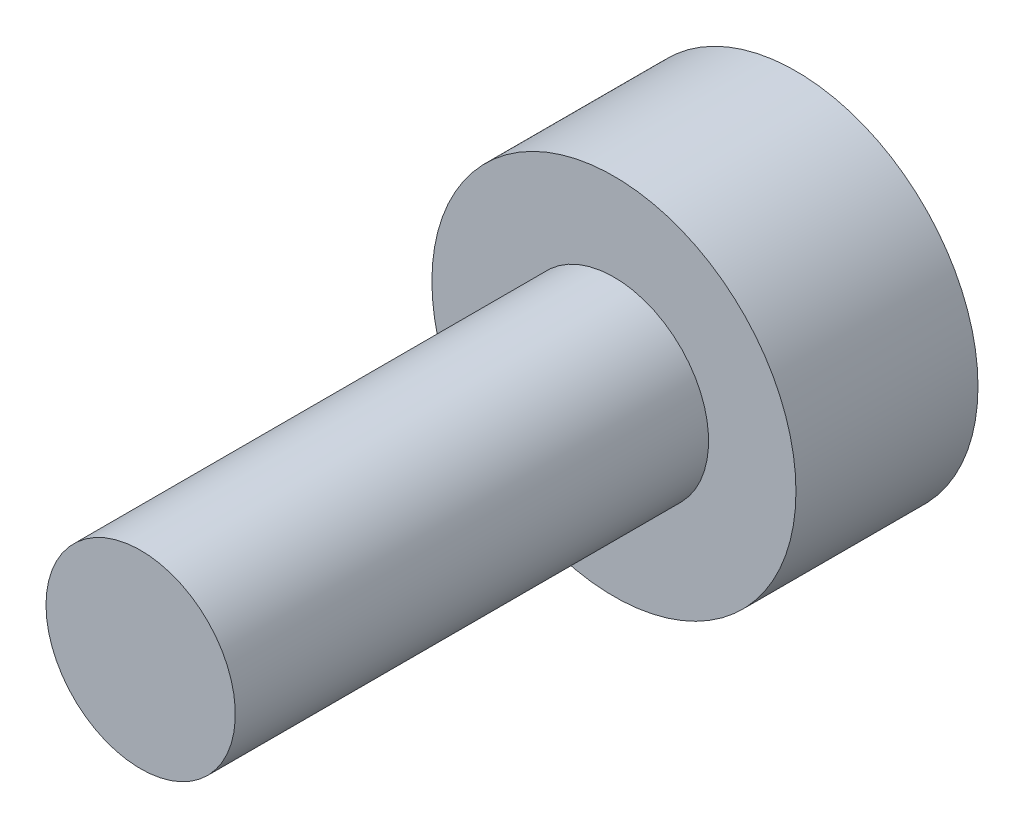
ISO-10303-21;
HEADER;
FILE_DESCRIPTION(('STEP AP214'),'2;1');
FILE_NAME('part.step','',(''),(''),'','','');
FILE_SCHEMA(('AUTOMOTIVE_DESIGN { 1 0 10303 214 1 1 1 1 }'));
ENDSEC;
DATA;
#1=APPLICATION_CONTEXT('core data for automotive mechanical design processes');
#2=APPLICATION_PROTOCOL_DEFINITION('international standard','automotive_design',2000,#1);
#3=PRODUCT_CONTEXT('',#1,'mechanical');
#4=PRODUCT('Part','Part','',(#3));
#5=PRODUCT_RELATED_PRODUCT_CATEGORY('part','',(#4));
#6=PRODUCT_DEFINITION_FORMATION('','',#4);
#7=PRODUCT_DEFINITION_CONTEXT('part definition',#1,'design');
#8=PRODUCT_DEFINITION('design','',#6,#7);
#9=PRODUCT_DEFINITION_SHAPE('','',#8);
#10=(LENGTH_UNIT() NAMED_UNIT(*) SI_UNIT(.MILLI.,.METRE.));
#11=(NAMED_UNIT(*) PLANE_ANGLE_UNIT() SI_UNIT($,.RADIAN.));
#12=(NAMED_UNIT(*) SI_UNIT($,.STERADIAN.) SOLID_ANGLE_UNIT());
#13=UNCERTAINTY_MEASURE_WITH_UNIT(LENGTH_MEASURE(1.E-05),#10,'distance_accuracy_value','');
#14=(GEOMETRIC_REPRESENTATION_CONTEXT(3) GLOBAL_UNCERTAINTY_ASSIGNED_CONTEXT((#13)) GLOBAL_UNIT_ASSIGNED_CONTEXT((#10,
#11,#12)) REPRESENTATION_CONTEXT('',''));
#15=CARTESIAN_POINT('',(0.,0.,0.));
#16=DIRECTION('',(0.,0.,1.));
#17=DIRECTION('',(1.,0.,0.));
#18=AXIS2_PLACEMENT_3D('',#15,#16,#17);
#19=CARTESIAN_POINT('',(0.,0.,13.));
#20=DIRECTION('',(0.,0.,-1.));
#21=DIRECTION('',(-1.,0.,0.));
#22=AXIS2_PLACEMENT_3D('',#19,#20,#21);
#23=CYLINDRICAL_SURFACE('',#22,2.6);
#24=CARTESIAN_POINT('',(0.,0.,13.));
#25=DIRECTION('',(0.,0.,1.));
#26=DIRECTION('',(1.,0.,0.));
#27=AXIS2_PLACEMENT_3D('',#24,#25,#26);
#28=CIRCLE('',#27,2.6);
#29=CARTESIAN_POINT('',(-2.6,0.,13.));
#30=VERTEX_POINT('',#29);
#31=EDGE_CURVE('E10',#30,#30,#28,.T.);
#32=CARTESIAN_POINT('',(0.,0.,0.));
#33=DIRECTION('',(0.,0.,1.));
#34=DIRECTION('',(1.,0.,0.));
#35=AXIS2_PLACEMENT_3D('',#32,#33,#34);
#36=CIRCLE('',#35,2.6);
#37=CARTESIAN_POINT('',(-2.6,0.,0.));
#38=VERTEX_POINT('',#37);
#39=EDGE_CURVE('E40',#38,#38,#36,.T.);
#40=CARTESIAN_POINT('',(-2.6,0.,13.));
#41=CARTESIAN_POINT('',(-2.6,0.,12.8645833333333));
#42=CARTESIAN_POINT('',(-2.6,0.,12.7291666666667));
#43=CARTESIAN_POINT('',(-2.6,0.,12.4583333333333));
#44=CARTESIAN_POINT('',(-2.6,0.,12.3229166666667));
#45=CARTESIAN_POINT('',(-2.6,0.,12.0520833333333));
#46=CARTESIAN_POINT('',(-2.6,0.,11.9166666666667));
#47=CARTESIAN_POINT('',(-2.6,0.,11.6458333333333));
#48=CARTESIAN_POINT('',(-2.6,0.,11.5104166666667));
#49=CARTESIAN_POINT('',(-2.6,0.,11.2395833333333));
#50=CARTESIAN_POINT('',(-2.6,0.,11.1041666666667));
#51=CARTESIAN_POINT('',(-2.6,0.,10.8333333333333));
#52=CARTESIAN_POINT('',(-2.6,0.,10.6979166666667));
#53=CARTESIAN_POINT('',(-2.6,0.,10.4270833333333));
#54=CARTESIAN_POINT('',(-2.6,0.,10.2916666666667));
#55=CARTESIAN_POINT('',(-2.6,0.,10.0208333333333));
#56=CARTESIAN_POINT('',(-2.6,0.,9.88541666666667));
#57=CARTESIAN_POINT('',(-2.6,0.,9.61458333333333));
#58=CARTESIAN_POINT('',(-2.6,0.,9.47916666666667));
#59=CARTESIAN_POINT('',(-2.6,0.,9.20833333333333));
#60=CARTESIAN_POINT('',(-2.6,0.,9.07291666666667));
#61=CARTESIAN_POINT('',(-2.6,0.,8.80208333333333));
#62=CARTESIAN_POINT('',(-2.6,0.,8.66666666666667));
#63=CARTESIAN_POINT('',(-2.6,0.,8.39583333333333));
#64=CARTESIAN_POINT('',(-2.6,0.,8.26041666666667));
#65=CARTESIAN_POINT('',(-2.6,0.,7.98958333333333));
#66=CARTESIAN_POINT('',(-2.6,0.,7.85416666666667));
#67=CARTESIAN_POINT('',(-2.6,0.,7.58333333333333));
#68=CARTESIAN_POINT('',(-2.6,0.,7.44791666666667));
#69=CARTESIAN_POINT('',(-2.6,0.,7.17708333333333));
#70=CARTESIAN_POINT('',(-2.6,0.,7.04166666666667));
#71=CARTESIAN_POINT('',(-2.6,0.,6.77083333333333));
#72=CARTESIAN_POINT('',(-2.6,0.,6.63541666666667));
#73=CARTESIAN_POINT('',(-2.6,0.,6.36458333333333));
#74=CARTESIAN_POINT('',(-2.6,0.,6.22916666666667));
#75=CARTESIAN_POINT('',(-2.6,0.,5.95833333333333));
#76=CARTESIAN_POINT('',(-2.6,0.,5.82291666666667));
#77=CARTESIAN_POINT('',(-2.6,0.,5.55208333333333));
#78=CARTESIAN_POINT('',(-2.6,0.,5.41666666666667));
#79=CARTESIAN_POINT('',(-2.6,0.,5.14583333333333));
#80=CARTESIAN_POINT('',(-2.6,0.,5.01041666666667));
#81=CARTESIAN_POINT('',(-2.6,0.,4.73958333333333));
#82=CARTESIAN_POINT('',(-2.6,0.,4.60416666666667));
#83=CARTESIAN_POINT('',(-2.6,0.,4.33333333333333));
#84=CARTESIAN_POINT('',(-2.6,0.,4.19791666666667));
#85=CARTESIAN_POINT('',(-2.6,0.,3.92708333333333));
#86=CARTESIAN_POINT('',(-2.6,0.,3.79166666666667));
#87=CARTESIAN_POINT('',(-2.6,0.,3.52083333333333));
#88=CARTESIAN_POINT('',(-2.6,0.,3.38541666666667));
#89=CARTESIAN_POINT('',(-2.6,0.,3.11458333333333));
#90=CARTESIAN_POINT('',(-2.6,0.,2.97916666666667));
#91=CARTESIAN_POINT('',(-2.6,0.,2.70833333333333));
#92=CARTESIAN_POINT('',(-2.6,0.,2.57291666666667));
#93=CARTESIAN_POINT('',(-2.6,0.,2.30208333333333));
#94=CARTESIAN_POINT('',(-2.6,0.,2.16666666666667));
#95=CARTESIAN_POINT('',(-2.6,0.,1.89583333333333));
#96=CARTESIAN_POINT('',(-2.6,0.,1.76041666666667));
#97=CARTESIAN_POINT('',(-2.6,0.,1.48958333333333));
#98=CARTESIAN_POINT('',(-2.6,0.,1.35416666666667));
#99=CARTESIAN_POINT('',(-2.6,0.,1.08333333333333));
#100=CARTESIAN_POINT('',(-2.6,0.,0.947916666666667));
#101=CARTESIAN_POINT('',(-2.6,0.,0.677083333333334));
#102=CARTESIAN_POINT('',(-2.6,0.,0.541666666666667));
#103=CARTESIAN_POINT('',(-2.6,0.,0.270833333333334));
#104=CARTESIAN_POINT('',(-2.6,0.,0.135416666666667));
#105=CARTESIAN_POINT('',(-2.6,0.,0.));
#106=B_SPLINE_CURVE_WITH_KNOTS('',3,(#40,#41,#42,#43,#44,#45,#46,#47,#48,#49,#50,#51,#52,#53,
#54,#55,#56,#57,#58,#59,#60,#61,#62,#63,#64,#65,#66,#67,#68,#69,#70,#71,#72,#73,#74,#75,#76,#77,
#78,#79,#80,#81,#82,#83,#84,#85,#86,#87,#88,#89,#90,#91,#92,#93,#94,#95,#96,#97,#98,#99,#100,
#101,#102,#103,#104,#105),.UNSPECIFIED.,.F.,.F.,(4,2,2,2,2,2,2,2,2,2,2,2,2,2,2,2,2,2,2,2,2,2,2,
2,2,2,2,2,2,2,2,2,4),(0.,0.406249999999999,0.812499999999999,1.21875,1.625,2.03125,2.4375,
2.84375,3.25,3.65625,4.0625,4.46875,4.875,5.28125,5.6875,6.09375,6.5,6.90625,7.3125,7.71875,
8.125,8.53125,8.9375,9.34375,9.75,10.15625,10.5625,10.96875,11.375,11.78125,12.1875,12.59375,
13.),.UNSPECIFIED.);
#107=EDGE_CURVE('BSEAM37',#30,#38,#106,.T.);
#108=ORIENTED_EDGE('',*,*,#31,.F.);
#109=ORIENTED_EDGE('',*,*,#39,.T.);
#110=ORIENTED_EDGE('',*,*,#107,.T.);
#111=ORIENTED_EDGE('',*,*,#107,.F.);
#112=EDGE_LOOP('',(#108,#110,#109,#111));
#113=FACE_BOUND('',#112,.T.);
#114=ADVANCED_FACE('F37',(#113),#23,.T.);
#115=CARTESIAN_POINT('',(0.,0.,13.));
#116=DIRECTION('',(0.,0.,1.));
#117=DIRECTION('',(1.,0.,0.));
#118=AXIS2_PLACEMENT_3D('',#115,#116,#117);
#119=PLANE('',#118);
#120=ORIENTED_EDGE('',*,*,#31,.T.);
#121=EDGE_LOOP('',(#120));
#122=FACE_BOUND('',#121,.T.);
#123=ADVANCED_FACE('F64',(#122),#119,.T.);
#124=CARTESIAN_POINT('',(0.,0.,-5.));
#125=DIRECTION('',(0.,0.,1.));
#126=DIRECTION('',(1.,0.,0.));
#127=AXIS2_PLACEMENT_3D('',#124,#125,#126);
#128=CYLINDRICAL_SURFACE('',#127,5.);
#129=CARTESIAN_POINT('',(0.,0.,-5.));
#130=DIRECTION('',(0.,0.,-1.));
#131=DIRECTION('',(-1.,0.,0.));
#132=AXIS2_PLACEMENT_3D('',#129,#130,#131);
#133=CIRCLE('',#132,5.);
#134=CARTESIAN_POINT('',(-5.,0.,-5.));
#135=VERTEX_POINT('',#134);
#136=EDGE_CURVE('E49',#135,#135,#133,.T.);
#137=ORIENTED_EDGE('',*,*,#136,.F.);
#138=EDGE_LOOP('',(#137));
#139=FACE_BOUND('',#138,.T.);
#140=CARTESIAN_POINT('',(0.,0.,0.));
#141=DIRECTION('',(0.,0.,-1.));
#142=DIRECTION('',(-1.,0.,0.));
#143=AXIS2_PLACEMENT_3D('',#140,#141,#142);
#144=CIRCLE('',#143,5.);
#145=CARTESIAN_POINT('',(-5.,0.,0.));
#146=VERTEX_POINT('',#145);
#147=EDGE_CURVE('E51',#146,#146,#144,.T.);
#148=ORIENTED_EDGE('',*,*,#147,.T.);
#149=EDGE_LOOP('',(#148));
#150=FACE_BOUND('',#149,.T.);
#151=ADVANCED_FACE('F61',(#139,#150),#128,.T.);
#152=CARTESIAN_POINT('',(0.,0.,-5.));
#153=DIRECTION('',(0.,0.,-1.));
#154=DIRECTION('',(-1.,0.,0.));
#155=AXIS2_PLACEMENT_3D('',#152,#153,#154);
#156=PLANE('',#155);
#157=ORIENTED_EDGE('',*,*,#136,.T.);
#158=EDGE_LOOP('',(#157));
#159=FACE_BOUND('',#158,.T.);
#160=ADVANCED_FACE('F59',(#159),#156,.T.);
#161=CARTESIAN_POINT('',(0.,0.,0.));
#162=DIRECTION('',(0.,0.,-1.));
#163=DIRECTION('',(-1.,0.,0.));
#164=AXIS2_PLACEMENT_3D('',#161,#162,#163);
#165=PLANE('',#164);
#166=ORIENTED_EDGE('',*,*,#39,.F.);
#167=EDGE_LOOP('',(#166));
#168=FACE_BOUND('',#167,.T.);
#169=ORIENTED_EDGE('',*,*,#147,.F.);
#170=EDGE_LOOP('',(#169));
#171=FACE_BOUND('',#170,.T.);
#172=ADVANCED_FACE('F68',(#168,#171),#165,.F.);
#173=CLOSED_SHELL('',(#114,#123,#151,#160,#172));
#174=MANIFOLD_SOLID_BREP('B2',#173);
#175=ADVANCED_BREP_SHAPE_REPRESENTATION('',(#18,#174),#14);
#176=SHAPE_DEFINITION_REPRESENTATION(#9,#175);
ENDSEC;
END-ISO-10303-21;
